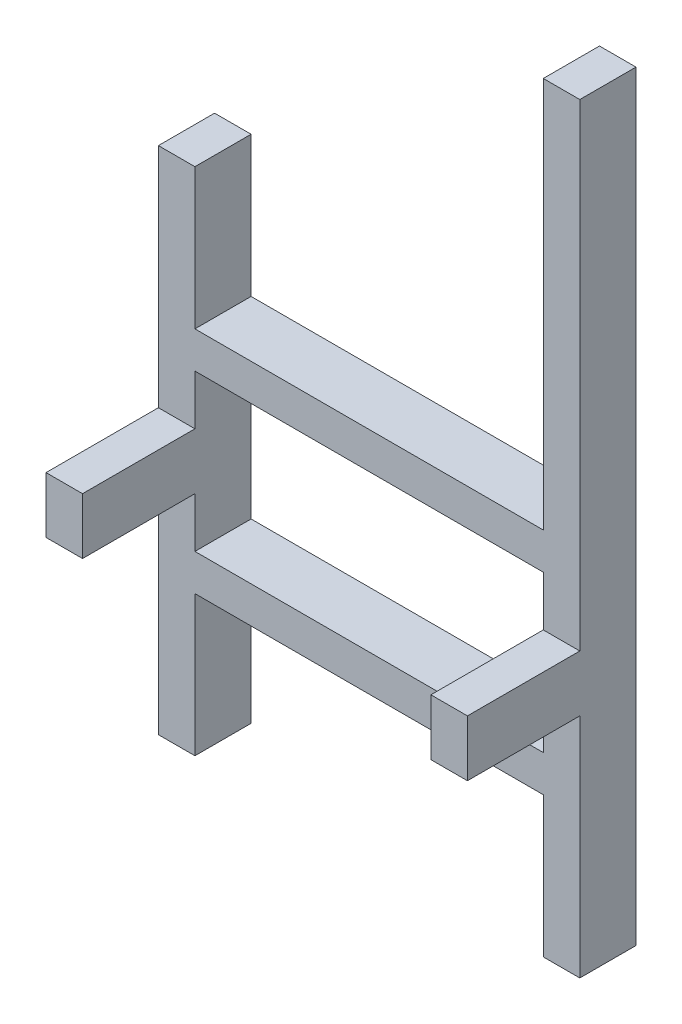
ISO-10303-21;
HEADER;
FILE_DESCRIPTION(('STEP AP214'),'2;1');
FILE_NAME('part.step','',(''),(''),'','','');
FILE_SCHEMA(('AUTOMOTIVE_DESIGN { 1 0 10303 214 1 1 1 1 }'));
ENDSEC;
DATA;
#1=APPLICATION_CONTEXT('core data for automotive mechanical design processes');
#2=APPLICATION_PROTOCOL_DEFINITION('international standard','automotive_design',2000,#1);
#3=PRODUCT_CONTEXT('',#1,'mechanical');
#4=PRODUCT('Part','Part','',(#3));
#5=PRODUCT_RELATED_PRODUCT_CATEGORY('part','',(#4));
#6=PRODUCT_DEFINITION_FORMATION('','',#4);
#7=PRODUCT_DEFINITION_CONTEXT('part definition',#1,'design');
#8=PRODUCT_DEFINITION('design','',#6,#7);
#9=PRODUCT_DEFINITION_SHAPE('','',#8);
#10=(LENGTH_UNIT() NAMED_UNIT(*) SI_UNIT(.MILLI.,.METRE.));
#11=(NAMED_UNIT(*) PLANE_ANGLE_UNIT() SI_UNIT($,.RADIAN.));
#12=(NAMED_UNIT(*) SI_UNIT($,.STERADIAN.) SOLID_ANGLE_UNIT());
#13=UNCERTAINTY_MEASURE_WITH_UNIT(LENGTH_MEASURE(1.E-05),#10,'distance_accuracy_value','');
#14=(GEOMETRIC_REPRESENTATION_CONTEXT(3) GLOBAL_UNCERTAINTY_ASSIGNED_CONTEXT((#13)) GLOBAL_UNIT_ASSIGNED_CONTEXT((#10,
#11,#12)) REPRESENTATION_CONTEXT('',''));
#15=CARTESIAN_POINT('',(0.,0.,0.));
#16=DIRECTION('',(0.,0.,1.));
#17=DIRECTION('',(1.,0.,0.));
#18=AXIS2_PLACEMENT_3D('',#15,#16,#17);
#19=CARTESIAN_POINT('',(0.,0.,10.));
#20=DIRECTION('',(0.,0.,-1.));
#21=DIRECTION('',(-1.,0.,0.));
#22=AXIS2_PLACEMENT_3D('',#19,#20,#21);
#23=PLANE('',#22);
#24=DIRECTION('',(1.,0.,0.));
#25=VECTOR('',#24,1.);
#26=CARTESIAN_POINT('',(0.,40.4,10.));
#27=LINE('',#26,#25);
#28=CARTESIAN_POINT('',(0.,40.4,10.));
#29=VERTEX_POINT('',#28);
#30=CARTESIAN_POINT('',(6.5,40.4,10.));
#31=VERTEX_POINT('',#30);
#32=EDGE_CURVE('E111',#29,#31,#27,.T.);
#33=ORIENTED_EDGE('',*,*,#32,.F.);
#34=DIRECTION('',(0.,-1.,0.));
#35=VECTOR('',#34,1.);
#36=CARTESIAN_POINT('',(0.,90.8,10.));
#37=LINE('',#36,#35);
#38=CARTESIAN_POINT('',(0.,0.,10.));
#39=VERTEX_POINT('',#38);
#40=EDGE_CURVE('E371',#29,#39,#37,.T.);
#41=ORIENTED_EDGE('',*,*,#40,.T.);
#42=DIRECTION('',(1.,0.,0.));
#43=VECTOR('',#42,1.);
#44=CARTESIAN_POINT('',(0.,0.,10.));
#45=LINE('',#44,#43);
#46=CARTESIAN_POINT('',(6.5,0.,10.));
#47=VERTEX_POINT('',#46);
#48=EDGE_CURVE('E356',#39,#47,#45,.T.);
#49=ORIENTED_EDGE('',*,*,#48,.T.);
#50=DIRECTION('',(0.,-1.,0.));
#51=VECTOR('',#50,1.);
#52=CARTESIAN_POINT('',(6.49999999999999,90.8,10.));
#53=LINE('',#52,#51);
#54=CARTESIAN_POINT('',(6.5,25.,10.));
#55=VERTEX_POINT('',#54);
#56=EDGE_CURVE('E360',#55,#47,#53,.T.);
#57=ORIENTED_EDGE('',*,*,#56,.F.);
#58=DIRECTION('',(1.,0.,0.));
#59=VECTOR('',#58,1.);
#60=CARTESIAN_POINT('',(6.50000000000001,25.,10.));
#61=LINE('',#60,#59);
#62=CARTESIAN_POINT('',(68.5,25.,10.));
#63=VERTEX_POINT('',#62);
#64=EDGE_CURVE('E411',#55,#63,#61,.T.);
#65=ORIENTED_EDGE('',*,*,#64,.T.);
#66=DIRECTION('',(0.,-1.,0.));
#67=VECTOR('',#66,1.);
#68=CARTESIAN_POINT('',(68.5,135.4,10.));
#69=LINE('',#68,#67);
#70=CARTESIAN_POINT('',(68.5,0.,10.));
#71=VERTEX_POINT('',#70);
#72=EDGE_CURVE('E446',#63,#71,#69,.T.);
#73=ORIENTED_EDGE('',*,*,#72,.T.);
#74=DIRECTION('',(1.,0.,0.));
#75=VECTOR('',#74,1.);
#76=CARTESIAN_POINT('',(68.5,0.,10.));
#77=LINE('',#76,#75);
#78=CARTESIAN_POINT('',(75.,0.,10.));
#79=VERTEX_POINT('',#78);
#80=EDGE_CURVE('E434',#71,#79,#77,.T.);
#81=ORIENTED_EDGE('',*,*,#80,.T.);
#82=DIRECTION('',(0.,-1.,0.));
#83=VECTOR('',#82,1.);
#84=CARTESIAN_POINT('',(75.,135.4,10.));
#85=LINE('',#84,#83);
#86=CARTESIAN_POINT('',(75.,40.4,10.));
#87=VERTEX_POINT('',#86);
#88=EDGE_CURVE('E118',#87,#79,#85,.T.);
#89=ORIENTED_EDGE('',*,*,#88,.F.);
#90=DIRECTION('',(1.,0.,0.));
#91=VECTOR('',#90,1.);
#92=CARTESIAN_POINT('',(68.5,40.4,10.));
#93=LINE('',#92,#91);
#94=CARTESIAN_POINT('',(68.5,40.4,10.));
#95=VERTEX_POINT('',#94);
#96=EDGE_CURVE('E311',#95,#87,#93,.T.);
#97=ORIENTED_EDGE('',*,*,#96,.F.);
#98=CARTESIAN_POINT('',(68.5,31.5,10.));
#99=VERTEX_POINT('',#98);
#100=EDGE_CURVE('E452',#95,#99,#69,.T.);
#101=ORIENTED_EDGE('',*,*,#100,.T.);
#102=DIRECTION('',(1.,0.,0.));
#103=VECTOR('',#102,1.);
#104=CARTESIAN_POINT('',(6.50000000000001,31.5,10.));
#105=LINE('',#104,#103);
#106=CARTESIAN_POINT('',(6.5,31.5,10.));
#107=VERTEX_POINT('',#106);
#108=EDGE_CURVE('E407',#107,#99,#105,.T.);
#109=ORIENTED_EDGE('',*,*,#108,.F.);
#110=EDGE_CURVE('E367',#31,#107,#53,.T.);
#111=ORIENTED_EDGE('',*,*,#110,.F.);
#112=EDGE_LOOP('',(#33,#41,#49,#57,#65,#73,#81,#89,#97,#101,#109,#111));
#113=FACE_BOUND('',#112,.T.);
#114=ADVANCED_FACE('F93',(#113),#23,.F.);
#115=DIRECTION('',(-1.,0.,0.));
#116=VECTOR('',#115,1.);
#117=CARTESIAN_POINT('',(0.,50.4,10.));
#118=LINE('',#117,#116);
#119=CARTESIAN_POINT('',(6.49999999999999,50.4,10.));
#120=VERTEX_POINT('',#119);
#121=CARTESIAN_POINT('',(0.,50.4,10.));
#122=VERTEX_POINT('',#121);
#123=EDGE_CURVE('E319',#120,#122,#118,.T.);
#124=ORIENTED_EDGE('',*,*,#123,.F.);
#125=CARTESIAN_POINT('',(6.5,59.3,10.));
#126=VERTEX_POINT('',#125);
#127=EDGE_CURVE('E281',#126,#120,#53,.T.);
#128=ORIENTED_EDGE('',*,*,#127,.F.);
#129=DIRECTION('',(1.,0.,0.));
#130=VECTOR('',#129,1.);
#131=CARTESIAN_POINT('',(6.5,59.3,10.));
#132=LINE('',#131,#130);
#133=CARTESIAN_POINT('',(68.5,59.3,10.));
#134=VERTEX_POINT('',#133);
#135=EDGE_CURVE('E331',#126,#134,#132,.T.);
#136=ORIENTED_EDGE('',*,*,#135,.T.);
#137=CARTESIAN_POINT('',(68.5,50.4,10.));
#138=VERTEX_POINT('',#137);
#139=EDGE_CURVE('E451',#134,#138,#69,.T.);
#140=ORIENTED_EDGE('',*,*,#139,.T.);
#141=DIRECTION('',(-1.,0.,0.));
#142=VECTOR('',#141,1.);
#143=CARTESIAN_POINT('',(68.5,50.4,10.));
#144=LINE('',#143,#142);
#145=CARTESIAN_POINT('',(75.,50.4,10.));
#146=VERTEX_POINT('',#145);
#147=EDGE_CURVE('E314',#146,#138,#144,.T.);
#148=ORIENTED_EDGE('',*,*,#147,.F.);
#149=CARTESIAN_POINT('',(75.,135.4,10.));
#150=VERTEX_POINT('',#149);
#151=EDGE_CURVE('E438',#150,#146,#85,.T.);
#152=ORIENTED_EDGE('',*,*,#151,.F.);
#153=DIRECTION('',(1.,0.,0.));
#154=VECTOR('',#153,1.);
#155=CARTESIAN_POINT('',(68.5,135.4,10.));
#156=LINE('',#155,#154);
#157=CARTESIAN_POINT('',(68.5,135.4,10.));
#158=VERTEX_POINT('',#157);
#159=EDGE_CURVE('E442',#158,#150,#156,.T.);
#160=ORIENTED_EDGE('',*,*,#159,.F.);
#161=CARTESIAN_POINT('',(68.5,65.8,10.));
#162=VERTEX_POINT('',#161);
#163=EDGE_CURVE('E447',#158,#162,#69,.T.);
#164=ORIENTED_EDGE('',*,*,#163,.T.);
#165=DIRECTION('',(1.,0.,0.));
#166=VECTOR('',#165,1.);
#167=CARTESIAN_POINT('',(6.5,65.8,10.));
#168=LINE('',#167,#166);
#169=CARTESIAN_POINT('',(6.5,65.8,10.));
#170=VERTEX_POINT('',#169);
#171=EDGE_CURVE('E335',#170,#162,#168,.T.);
#172=ORIENTED_EDGE('',*,*,#171,.F.);
#173=CARTESIAN_POINT('',(6.49999999999999,90.8,10.));
#174=VERTEX_POINT('',#173);
#175=EDGE_CURVE('E362',#174,#170,#53,.T.);
#176=ORIENTED_EDGE('',*,*,#175,.F.);
#177=DIRECTION('',(1.,0.,0.));
#178=VECTOR('',#177,1.);
#179=CARTESIAN_POINT('',(0.,90.8,10.));
#180=LINE('',#179,#178);
#181=CARTESIAN_POINT('',(0.,90.8,10.));
#182=VERTEX_POINT('',#181);
#183=EDGE_CURVE('E366',#182,#174,#180,.T.);
#184=ORIENTED_EDGE('',*,*,#183,.F.);
#185=EDGE_CURVE('E372',#182,#122,#37,.T.);
#186=ORIENTED_EDGE('',*,*,#185,.T.);
#187=EDGE_LOOP('',(#124,#128,#136,#140,#148,#152,#160,#164,#172,#176,#184,#186));
#188=FACE_BOUND('',#187,.T.);
#189=ADVANCED_FACE('F496',(#188),#23,.F.);
#190=CARTESIAN_POINT('',(6.5,65.8,10.));
#191=DIRECTION('',(0.,1.,0.));
#192=DIRECTION('',(0.,0.,1.));
#193=AXIS2_PLACEMENT_3D('',#190,#191,#192);
#194=PLANE('',#193);
#195=DIRECTION('',(1.,0.,0.));
#196=VECTOR('',#195,1.);
#197=CARTESIAN_POINT('',(6.5,65.8,0.));
#198=LINE('',#197,#196);
#199=CARTESIAN_POINT('',(6.5,65.8,0.));
#200=VERTEX_POINT('',#199);
#201=CARTESIAN_POINT('',(68.5,65.8,0.));
#202=VERTEX_POINT('',#201);
#203=EDGE_CURVE('E336',#200,#202,#198,.T.);
#204=ORIENTED_EDGE('',*,*,#203,.F.);
#205=DIRECTION('',(0.,0.,-1.));
#206=VECTOR('',#205,1.);
#207=CARTESIAN_POINT('',(6.5,65.8,10.));
#208=LINE('',#207,#206);
#209=EDGE_CURVE('E351',#170,#200,#208,.T.);
#210=ORIENTED_EDGE('',*,*,#209,.F.);
#211=ORIENTED_EDGE('',*,*,#171,.T.);
#212=DIRECTION('',(0.,0.,-1.));
#213=VECTOR('',#212,1.);
#214=CARTESIAN_POINT('',(68.5,65.8,10.));
#215=LINE('',#214,#213);
#216=EDGE_CURVE('E103',#162,#202,#215,.T.);
#217=ORIENTED_EDGE('',*,*,#216,.T.);
#218=EDGE_LOOP('',(#204,#210,#211,#217));
#219=FACE_BOUND('',#218,.T.);
#220=ADVANCED_FACE('F590',(#219),#194,.T.);
#221=CARTESIAN_POINT('',(6.5,59.3,10.));
#222=DIRECTION('',(0.,1.,0.));
#223=DIRECTION('',(0.,0.,1.));
#224=AXIS2_PLACEMENT_3D('',#221,#222,#223);
#225=PLANE('',#224);
#226=DIRECTION('',(1.,0.,0.));
#227=VECTOR('',#226,1.);
#228=CARTESIAN_POINT('',(6.5,59.3,0.));
#229=LINE('',#228,#227);
#230=CARTESIAN_POINT('',(6.5,59.3,0.));
#231=VERTEX_POINT('',#230);
#232=CARTESIAN_POINT('',(68.5,59.3,0.));
#233=VERTEX_POINT('',#232);
#234=EDGE_CURVE('E341',#231,#233,#229,.T.);
#235=ORIENTED_EDGE('',*,*,#234,.T.);
#236=DIRECTION('',(0.,0.,-1.));
#237=VECTOR('',#236,1.);
#238=CARTESIAN_POINT('',(68.5,59.3,10.));
#239=LINE('',#238,#237);
#240=EDGE_CURVE('E12',#134,#233,#239,.T.);
#241=ORIENTED_EDGE('',*,*,#240,.F.);
#242=ORIENTED_EDGE('',*,*,#135,.F.);
#243=DIRECTION('',(0.,0.,-1.));
#244=VECTOR('',#243,1.);
#245=CARTESIAN_POINT('',(6.5,59.3,10.));
#246=LINE('',#245,#244);
#247=EDGE_CURVE('E340',#126,#231,#246,.T.);
#248=ORIENTED_EDGE('',*,*,#247,.T.);
#249=EDGE_LOOP('',(#235,#241,#242,#248));
#250=FACE_BOUND('',#249,.T.);
#251=ADVANCED_FACE('F596',(#250),#225,.F.);
#252=CARTESIAN_POINT('',(0.,0.,0.));
#253=DIRECTION('',(0.,0.,-1.));
#254=DIRECTION('',(-1.,0.,0.));
#255=AXIS2_PLACEMENT_3D('',#252,#253,#254);
#256=PLANE('',#255);
#257=DIRECTION('',(1.,0.,0.));
#258=VECTOR('',#257,1.);
#259=CARTESIAN_POINT('',(6.50000000000001,31.5,0.));
#260=LINE('',#259,#258);
#261=CARTESIAN_POINT('',(6.5,31.5,0.));
#262=VERTEX_POINT('',#261);
#263=CARTESIAN_POINT('',(68.5,31.5,0.));
#264=VERTEX_POINT('',#263);
#265=EDGE_CURVE('E417',#262,#264,#260,.T.);
#266=ORIENTED_EDGE('',*,*,#265,.T.);
#267=DIRECTION('',(0.,-1.,0.));
#268=VECTOR('',#267,1.);
#269=CARTESIAN_POINT('',(68.5,135.4,0.));
#270=LINE('',#269,#268);
#271=EDGE_CURVE('E465',#233,#264,#270,.T.);
#272=ORIENTED_EDGE('',*,*,#271,.F.);
#273=ORIENTED_EDGE('',*,*,#234,.F.);
#274=DIRECTION('',(0.,-1.,0.));
#275=VECTOR('',#274,1.);
#276=CARTESIAN_POINT('',(6.49999999999999,90.8,0.));
#277=LINE('',#276,#275);
#278=EDGE_CURVE('E387',#231,#262,#277,.T.);
#279=ORIENTED_EDGE('',*,*,#278,.T.);
#280=EDGE_LOOP('',(#266,#272,#273,#279));
#281=FACE_BOUND('',#280,.T.);
#282=CARTESIAN_POINT('',(68.5,25.,0.));
#283=VERTEX_POINT('',#282);
#284=CARTESIAN_POINT('',(68.5,0.,0.));
#285=VERTEX_POINT('',#284);
#286=EDGE_CURVE('E461',#283,#285,#270,.T.);
#287=ORIENTED_EDGE('',*,*,#286,.F.);
#288=DIRECTION('',(1.,0.,0.));
#289=VECTOR('',#288,1.);
#290=CARTESIAN_POINT('',(6.50000000000001,25.,0.));
#291=LINE('',#290,#289);
#292=CARTESIAN_POINT('',(6.5,25.,0.));
#293=VERTEX_POINT('',#292);
#294=EDGE_CURVE('E412',#293,#283,#291,.T.);
#295=ORIENTED_EDGE('',*,*,#294,.F.);
#296=CARTESIAN_POINT('',(6.5,0.,0.));
#297=VERTEX_POINT('',#296);
#298=EDGE_CURVE('E380',#293,#297,#277,.T.);
#299=ORIENTED_EDGE('',*,*,#298,.T.);
#300=DIRECTION('',(1.,0.,0.));
#301=VECTOR('',#300,1.);
#302=CARTESIAN_POINT('',(0.,0.,0.));
#303=LINE('',#302,#301);
#304=CARTESIAN_POINT('',(0.,0.,0.));
#305=VERTEX_POINT('',#304);
#306=EDGE_CURVE('E376',#305,#297,#303,.T.);
#307=ORIENTED_EDGE('',*,*,#306,.F.);
#308=DIRECTION('',(0.,-1.,0.));
#309=VECTOR('',#308,1.);
#310=CARTESIAN_POINT('',(0.,90.8,0.));
#311=LINE('',#310,#309);
#312=CARTESIAN_POINT('',(0.,90.8,0.));
#313=VERTEX_POINT('',#312);
#314=EDGE_CURVE('E361',#313,#305,#311,.T.);
#315=ORIENTED_EDGE('',*,*,#314,.F.);
#316=DIRECTION('',(1.,0.,0.));
#317=VECTOR('',#316,1.);
#318=CARTESIAN_POINT('',(0.,90.8,0.));
#319=LINE('',#318,#317);
#320=CARTESIAN_POINT('',(6.49999999999999,90.8,0.));
#321=VERTEX_POINT('',#320);
#322=EDGE_CURVE('E386',#313,#321,#319,.T.);
#323=ORIENTED_EDGE('',*,*,#322,.T.);
#324=EDGE_CURVE('E382',#321,#200,#277,.T.);
#325=ORIENTED_EDGE('',*,*,#324,.T.);
#326=ORIENTED_EDGE('',*,*,#203,.T.);
#327=CARTESIAN_POINT('',(68.5,135.4,0.));
#328=VERTEX_POINT('',#327);
#329=EDGE_CURVE('E437',#328,#202,#270,.T.);
#330=ORIENTED_EDGE('',*,*,#329,.F.);
#331=DIRECTION('',(1.,0.,0.));
#332=VECTOR('',#331,1.);
#333=CARTESIAN_POINT('',(68.5,135.4,0.));
#334=LINE('',#333,#332);
#335=CARTESIAN_POINT('',(75.,135.4,0.));
#336=VERTEX_POINT('',#335);
#337=EDGE_CURVE('E457',#328,#336,#334,.T.);
#338=ORIENTED_EDGE('',*,*,#337,.T.);
#339=DIRECTION('',(0.,-1.,0.));
#340=VECTOR('',#339,1.);
#341=CARTESIAN_POINT('',(75.,135.4,0.));
#342=LINE('',#341,#340);
#343=CARTESIAN_POINT('',(75.,0.,0.));
#344=VERTEX_POINT('',#343);
#345=EDGE_CURVE('E288',#336,#344,#342,.T.);
#346=ORIENTED_EDGE('',*,*,#345,.T.);
#347=DIRECTION('',(1.,0.,0.));
#348=VECTOR('',#347,1.);
#349=CARTESIAN_POINT('',(68.5,0.,0.));
#350=LINE('',#349,#348);
#351=EDGE_CURVE('E283',#285,#344,#350,.T.);
#352=ORIENTED_EDGE('',*,*,#351,.F.);
#353=EDGE_LOOP('',(#287,#295,#299,#307,#315,#323,#325,#326,#330,#338,#346,#352));
#354=FACE_BOUND('',#353,.T.);
#355=ADVANCED_FACE('F486',(#281,#354),#256,.T.);
#356=CARTESIAN_POINT('',(6.50000000000001,25.,10.));
#357=DIRECTION('',(0.,1.,0.));
#358=DIRECTION('',(0.,0.,1.));
#359=AXIS2_PLACEMENT_3D('',#356,#357,#358);
#360=PLANE('',#359);
#361=ORIENTED_EDGE('',*,*,#294,.T.);
#362=DIRECTION('',(0.,0.,-1.));
#363=VECTOR('',#362,1.);
#364=CARTESIAN_POINT('',(68.5,25.,10.));
#365=LINE('',#364,#363);
#366=EDGE_CURVE('E381',#63,#283,#365,.T.);
#367=ORIENTED_EDGE('',*,*,#366,.F.);
#368=ORIENTED_EDGE('',*,*,#64,.F.);
#369=DIRECTION('',(0.,0.,-1.));
#370=VECTOR('',#369,1.);
#371=CARTESIAN_POINT('',(6.50000000000001,25.,10.));
#372=LINE('',#371,#370);
#373=EDGE_CURVE('E345',#55,#293,#372,.T.);
#374=ORIENTED_EDGE('',*,*,#373,.T.);
#375=EDGE_LOOP('',(#361,#367,#368,#374));
#376=FACE_BOUND('',#375,.T.);
#377=ADVANCED_FACE('F578',(#376),#360,.F.);
#378=CARTESIAN_POINT('',(6.50000000000001,31.5,10.));
#379=DIRECTION('',(0.,1.,0.));
#380=DIRECTION('',(0.,0.,1.));
#381=AXIS2_PLACEMENT_3D('',#378,#379,#380);
#382=PLANE('',#381);
#383=ORIENTED_EDGE('',*,*,#265,.F.);
#384=DIRECTION('',(0.,0.,-1.));
#385=VECTOR('',#384,1.);
#386=CARTESIAN_POINT('',(6.50000000000001,31.5,10.));
#387=LINE('',#386,#385);
#388=EDGE_CURVE('E406',#107,#262,#387,.T.);
#389=ORIENTED_EDGE('',*,*,#388,.F.);
#390=ORIENTED_EDGE('',*,*,#108,.T.);
#391=DIRECTION('',(0.,0.,-1.));
#392=VECTOR('',#391,1.);
#393=CARTESIAN_POINT('',(68.5,31.5,10.));
#394=LINE('',#393,#392);
#395=EDGE_CURVE('E416',#99,#264,#394,.T.);
#396=ORIENTED_EDGE('',*,*,#395,.T.);
#397=EDGE_LOOP('',(#383,#389,#390,#396));
#398=FACE_BOUND('',#397,.T.);
#399=ADVANCED_FACE('F532',(#398),#382,.T.);
#400=CARTESIAN_POINT('',(6.49999999999999,90.8,10.));
#401=DIRECTION('',(1.,0.,0.));
#402=DIRECTION('',(0.,1.,0.));
#403=AXIS2_PLACEMENT_3D('',#400,#401,#402);
#404=PLANE('',#403);
#405=ORIENTED_EDGE('',*,*,#373,.F.);
#406=ORIENTED_EDGE('',*,*,#56,.T.);
#407=DIRECTION('',(0.,0.,-1.));
#408=VECTOR('',#407,1.);
#409=CARTESIAN_POINT('',(6.5,0.,10.));
#410=LINE('',#409,#408);
#411=EDGE_CURVE('E402',#47,#297,#410,.T.);
#412=ORIENTED_EDGE('',*,*,#411,.T.);
#413=ORIENTED_EDGE('',*,*,#298,.F.);
#414=EDGE_LOOP('',(#405,#406,#412,#413));
#415=FACE_BOUND('',#414,.T.);
#416=ADVANCED_FACE('F566',(#415),#404,.T.);
#417=CARTESIAN_POINT('',(75.,135.4,10.));
#418=DIRECTION('',(1.,0.,0.));
#419=DIRECTION('',(0.,1.,0.));
#420=AXIS2_PLACEMENT_3D('',#417,#418,#419);
#421=PLANE('',#420);
#422=ORIENTED_EDGE('',*,*,#345,.F.);
#423=DIRECTION('',(0.,0.,-1.));
#424=VECTOR('',#423,1.);
#425=CARTESIAN_POINT('',(75.,135.4,10.));
#426=LINE('',#425,#424);
#427=EDGE_CURVE('E471',#150,#336,#426,.T.);
#428=ORIENTED_EDGE('',*,*,#427,.F.);
#429=ORIENTED_EDGE('',*,*,#151,.T.);
#430=DIRECTION('',(0.,0.,-1.));
#431=VECTOR('',#430,1.);
#432=CARTESIAN_POINT('',(75.,50.4,30.));
#433=LINE('',#432,#431);
#434=CARTESIAN_POINT('',(75.,50.4,30.));
#435=VERTEX_POINT('',#434);
#436=EDGE_CURVE('E294',#435,#146,#433,.T.);
#437=ORIENTED_EDGE('',*,*,#436,.F.);
#438=DIRECTION('',(0.,1.,0.));
#439=VECTOR('',#438,1.);
#440=CARTESIAN_POINT('',(75.,40.4,30.));
#441=LINE('',#440,#439);
#442=CARTESIAN_POINT('',(75.,40.4,30.));
#443=VERTEX_POINT('',#442);
#444=EDGE_CURVE('E315',#443,#435,#441,.T.);
#445=ORIENTED_EDGE('',*,*,#444,.F.);
#446=DIRECTION('',(0.,0.,-1.));
#447=VECTOR('',#446,1.);
#448=CARTESIAN_POINT('',(75.,40.4,30.));
#449=LINE('',#448,#447);
#450=EDGE_CURVE('E306',#443,#87,#449,.T.);
#451=ORIENTED_EDGE('',*,*,#450,.T.);
#452=ORIENTED_EDGE('',*,*,#88,.T.);
#453=DIRECTION('',(0.,0.,-1.));
#454=VECTOR('',#453,1.);
#455=CARTESIAN_POINT('',(75.,0.,10.));
#456=LINE('',#455,#454);
#457=EDGE_CURVE('E97',#79,#344,#456,.T.);
#458=ORIENTED_EDGE('',*,*,#457,.T.);
#459=EDGE_LOOP('',(#422,#428,#429,#437,#445,#451,#452,#458));
#460=FACE_BOUND('',#459,.T.);
#461=ADVANCED_FACE('F479',(#460),#421,.T.);
#462=CARTESIAN_POINT('',(68.5,135.4,10.));
#463=DIRECTION('',(0.,1.,0.));
#464=DIRECTION('',(-1.,0.,0.));
#465=AXIS2_PLACEMENT_3D('',#462,#463,#464);
#466=PLANE('',#465);
#467=ORIENTED_EDGE('',*,*,#337,.F.);
#468=DIRECTION('',(0.,0.,-1.));
#469=VECTOR('',#468,1.);
#470=CARTESIAN_POINT('',(68.5,135.4,10.));
#471=LINE('',#470,#469);
#472=EDGE_CURVE('E469',#158,#328,#471,.T.);
#473=ORIENTED_EDGE('',*,*,#472,.F.);
#474=ORIENTED_EDGE('',*,*,#159,.T.);
#475=ORIENTED_EDGE('',*,*,#427,.T.);
#476=EDGE_LOOP('',(#467,#473,#474,#475));
#477=FACE_BOUND('',#476,.T.);
#478=ADVANCED_FACE('F488',(#477),#466,.T.);
#479=CARTESIAN_POINT('',(68.5,135.4,10.));
#480=DIRECTION('',(1.,0.,0.));
#481=DIRECTION('',(0.,1.,0.));
#482=AXIS2_PLACEMENT_3D('',#479,#480,#481);
#483=PLANE('',#482);
#484=ORIENTED_EDGE('',*,*,#216,.F.);
#485=ORIENTED_EDGE('',*,*,#163,.F.);
#486=ORIENTED_EDGE('',*,*,#472,.T.);
#487=ORIENTED_EDGE('',*,*,#329,.T.);
#488=EDGE_LOOP('',(#484,#485,#486,#487));
#489=FACE_BOUND('',#488,.T.);
#490=ADVANCED_FACE('F492',(#489),#483,.F.);
#491=ORIENTED_EDGE('',*,*,#139,.F.);
#492=ORIENTED_EDGE('',*,*,#240,.T.);
#493=ORIENTED_EDGE('',*,*,#271,.T.);
#494=ORIENTED_EDGE('',*,*,#395,.F.);
#495=ORIENTED_EDGE('',*,*,#100,.F.);
#496=DIRECTION('',(0.,0.,-1.));
#497=VECTOR('',#496,1.);
#498=CARTESIAN_POINT('',(68.5,40.4,30.));
#499=LINE('',#498,#497);
#500=CARTESIAN_POINT('',(68.5,40.4,30.));
#501=VERTEX_POINT('',#500);
#502=EDGE_CURVE('E302',#501,#95,#499,.T.);
#503=ORIENTED_EDGE('',*,*,#502,.F.);
#504=DIRECTION('',(0.,-1.,0.));
#505=VECTOR('',#504,1.);
#506=CARTESIAN_POINT('',(68.5,40.4,30.));
#507=LINE('',#506,#505);
#508=CARTESIAN_POINT('',(68.5,50.4,30.));
#509=VERTEX_POINT('',#508);
#510=EDGE_CURVE('E322',#509,#501,#507,.T.);
#511=ORIENTED_EDGE('',*,*,#510,.F.);
#512=DIRECTION('',(0.,0.,-1.));
#513=VECTOR('',#512,1.);
#514=CARTESIAN_POINT('',(68.5,50.4,30.));
#515=LINE('',#514,#513);
#516=EDGE_CURVE('E298',#509,#138,#515,.T.);
#517=ORIENTED_EDGE('',*,*,#516,.T.);
#518=EDGE_LOOP('',(#491,#492,#493,#494,#495,#503,#511,#517));
#519=FACE_BOUND('',#518,.T.);
#520=ADVANCED_FACE('F515',(#519),#483,.F.);
#521=ORIENTED_EDGE('',*,*,#72,.F.);
#522=ORIENTED_EDGE('',*,*,#366,.T.);
#523=ORIENTED_EDGE('',*,*,#286,.T.);
#524=DIRECTION('',(0.,0.,-1.));
#525=VECTOR('',#524,1.);
#526=CARTESIAN_POINT('',(68.5,0.,10.));
#527=LINE('',#526,#525);
#528=EDGE_CURVE('E450',#71,#285,#527,.T.);
#529=ORIENTED_EDGE('',*,*,#528,.F.);
#530=EDGE_LOOP('',(#521,#522,#523,#529));
#531=FACE_BOUND('',#530,.T.);
#532=ADVANCED_FACE('F523',(#531),#483,.F.);
#533=CARTESIAN_POINT('',(68.5,0.,10.));
#534=DIRECTION('',(0.,1.,0.));
#535=DIRECTION('',(0.,0.,1.));
#536=AXIS2_PLACEMENT_3D('',#533,#534,#535);
#537=PLANE('',#536);
#538=ORIENTED_EDGE('',*,*,#351,.T.);
#539=ORIENTED_EDGE('',*,*,#457,.F.);
#540=ORIENTED_EDGE('',*,*,#80,.F.);
#541=ORIENTED_EDGE('',*,*,#528,.T.);
#542=EDGE_LOOP('',(#538,#539,#540,#541));
#543=FACE_BOUND('',#542,.T.);
#544=ADVANCED_FACE('F95',(#543),#537,.F.);
#545=ORIENTED_EDGE('',*,*,#247,.F.);
#546=ORIENTED_EDGE('',*,*,#127,.T.);
#547=DIRECTION('',(0.,0.,-1.));
#548=VECTOR('',#547,1.);
#549=CARTESIAN_POINT('',(6.5,50.4,30.));
#550=LINE('',#549,#548);
#551=CARTESIAN_POINT('',(6.5,50.4,30.));
#552=VERTEX_POINT('',#551);
#553=EDGE_CURVE('E260',#552,#120,#550,.T.);
#554=ORIENTED_EDGE('',*,*,#553,.F.);
#555=DIRECTION('',(0.,1.,0.));
#556=VECTOR('',#555,1.);
#557=CARTESIAN_POINT('',(6.5,40.4,30.));
#558=LINE('',#557,#556);
#559=CARTESIAN_POINT('',(6.5,40.4,30.));
#560=VERTEX_POINT('',#559);
#561=EDGE_CURVE('E267',#560,#552,#558,.T.);
#562=ORIENTED_EDGE('',*,*,#561,.F.);
#563=DIRECTION('',(0.,0.,-1.));
#564=VECTOR('',#563,1.);
#565=CARTESIAN_POINT('',(6.5,40.4,30.));
#566=LINE('',#565,#564);
#567=EDGE_CURVE('E540',#560,#31,#566,.T.);
#568=ORIENTED_EDGE('',*,*,#567,.T.);
#569=ORIENTED_EDGE('',*,*,#110,.T.);
#570=ORIENTED_EDGE('',*,*,#388,.T.);
#571=ORIENTED_EDGE('',*,*,#278,.F.);
#572=EDGE_LOOP('',(#545,#546,#554,#562,#568,#569,#570,#571));
#573=FACE_BOUND('',#572,.T.);
#574=ADVANCED_FACE('F279',(#573),#404,.T.);
#575=ORIENTED_EDGE('',*,*,#175,.T.);
#576=ORIENTED_EDGE('',*,*,#209,.T.);
#577=ORIENTED_EDGE('',*,*,#324,.F.);
#578=DIRECTION('',(0.,0.,-1.));
#579=VECTOR('',#578,1.);
#580=CARTESIAN_POINT('',(6.49999999999999,90.8,10.));
#581=LINE('',#580,#579);
#582=EDGE_CURVE('E399',#174,#321,#581,.T.);
#583=ORIENTED_EDGE('',*,*,#582,.F.);
#584=EDGE_LOOP('',(#575,#576,#577,#583));
#585=FACE_BOUND('',#584,.T.);
#586=ADVANCED_FACE('F583',(#585),#404,.T.);
#587=CARTESIAN_POINT('',(0.,90.8,10.));
#588=DIRECTION('',(0.,1.,0.));
#589=DIRECTION('',(0.,0.,1.));
#590=AXIS2_PLACEMENT_3D('',#587,#588,#589);
#591=PLANE('',#590);
#592=ORIENTED_EDGE('',*,*,#322,.F.);
#593=DIRECTION('',(0.,0.,-1.));
#594=VECTOR('',#593,1.);
#595=CARTESIAN_POINT('',(0.,90.8,10.));
#596=LINE('',#595,#594);
#597=EDGE_CURVE('E396',#182,#313,#596,.T.);
#598=ORIENTED_EDGE('',*,*,#597,.F.);
#599=ORIENTED_EDGE('',*,*,#183,.T.);
#600=ORIENTED_EDGE('',*,*,#582,.T.);
#601=EDGE_LOOP('',(#592,#598,#599,#600));
#602=FACE_BOUND('',#601,.T.);
#603=ADVANCED_FACE('F571',(#602),#591,.T.);
#604=CARTESIAN_POINT('',(0.,90.8,10.));
#605=DIRECTION('',(1.,0.,0.));
#606=DIRECTION('',(0.,1.,0.));
#607=AXIS2_PLACEMENT_3D('',#604,#605,#606);
#608=PLANE('',#607);
#609=ORIENTED_EDGE('',*,*,#314,.T.);
#610=DIRECTION('',(0.,0.,-1.));
#611=VECTOR('',#610,1.);
#612=CARTESIAN_POINT('',(0.,0.,10.));
#613=LINE('',#612,#611);
#614=EDGE_CURVE('E375',#39,#305,#613,.T.);
#615=ORIENTED_EDGE('',*,*,#614,.F.);
#616=ORIENTED_EDGE('',*,*,#40,.F.);
#617=DIRECTION('',(0.,0.,-1.));
#618=VECTOR('',#617,1.);
#619=CARTESIAN_POINT('',(0.,40.4,30.));
#620=LINE('',#619,#618);
#621=CARTESIAN_POINT('',(0.,40.4,30.));
#622=VERTEX_POINT('',#621);
#623=EDGE_CURVE('E290',#622,#29,#620,.T.);
#624=ORIENTED_EDGE('',*,*,#623,.F.);
#625=DIRECTION('',(0.,-1.,0.));
#626=VECTOR('',#625,1.);
#627=CARTESIAN_POINT('',(0.,40.4,30.));
#628=LINE('',#627,#626);
#629=CARTESIAN_POINT('',(0.,50.4,30.));
#630=VERTEX_POINT('',#629);
#631=EDGE_CURVE('E266',#630,#622,#628,.T.);
#632=ORIENTED_EDGE('',*,*,#631,.F.);
#633=DIRECTION('',(0.,0.,-1.));
#634=VECTOR('',#633,1.);
#635=CARTESIAN_POINT('',(0.,50.4,30.));
#636=LINE('',#635,#634);
#637=EDGE_CURVE('E262',#630,#122,#636,.T.);
#638=ORIENTED_EDGE('',*,*,#637,.T.);
#639=ORIENTED_EDGE('',*,*,#185,.F.);
#640=ORIENTED_EDGE('',*,*,#597,.T.);
#641=EDGE_LOOP('',(#609,#615,#616,#624,#632,#638,#639,#640));
#642=FACE_BOUND('',#641,.T.);
#643=ADVANCED_FACE('F554',(#642),#608,.F.);
#644=CARTESIAN_POINT('',(0.,0.,10.));
#645=DIRECTION('',(0.,1.,0.));
#646=DIRECTION('',(0.,0.,1.));
#647=AXIS2_PLACEMENT_3D('',#644,#645,#646);
#648=PLANE('',#647);
#649=ORIENTED_EDGE('',*,*,#306,.T.);
#650=ORIENTED_EDGE('',*,*,#411,.F.);
#651=ORIENTED_EDGE('',*,*,#48,.F.);
#652=ORIENTED_EDGE('',*,*,#614,.T.);
#653=EDGE_LOOP('',(#649,#650,#651,#652));
#654=FACE_BOUND('',#653,.T.);
#655=ADVANCED_FACE('F568',(#654),#648,.F.);
#656=CARTESIAN_POINT('',(68.5,50.4,30.));
#657=DIRECTION('',(0.,-1.,0.));
#658=DIRECTION('',(0.,0.,-1.));
#659=AXIS2_PLACEMENT_3D('',#656,#657,#658);
#660=PLANE('',#659);
#661=ORIENTED_EDGE('',*,*,#147,.T.);
#662=ORIENTED_EDGE('',*,*,#516,.F.);
#663=DIRECTION('',(-1.,0.,0.));
#664=VECTOR('',#663,1.);
#665=CARTESIAN_POINT('',(68.5,50.4,30.));
#666=LINE('',#665,#664);
#667=EDGE_CURVE('E325',#435,#509,#666,.T.);
#668=ORIENTED_EDGE('',*,*,#667,.F.);
#669=ORIENTED_EDGE('',*,*,#436,.T.);
#670=EDGE_LOOP('',(#661,#662,#668,#669));
#671=FACE_BOUND('',#670,.T.);
#672=ADVANCED_FACE('F500',(#671),#660,.F.);
#673=CARTESIAN_POINT('',(68.5,40.4,30.));
#674=DIRECTION('',(0.,1.,0.));
#675=DIRECTION('',(0.,0.,1.));
#676=AXIS2_PLACEMENT_3D('',#673,#674,#675);
#677=PLANE('',#676);
#678=ORIENTED_EDGE('',*,*,#96,.T.);
#679=ORIENTED_EDGE('',*,*,#450,.F.);
#680=DIRECTION('',(1.,0.,0.));
#681=VECTOR('',#680,1.);
#682=CARTESIAN_POINT('',(68.5,40.4,30.));
#683=LINE('',#682,#681);
#684=EDGE_CURVE('E310',#501,#443,#683,.T.);
#685=ORIENTED_EDGE('',*,*,#684,.F.);
#686=ORIENTED_EDGE('',*,*,#502,.T.);
#687=EDGE_LOOP('',(#678,#679,#685,#686));
#688=FACE_BOUND('',#687,.T.);
#689=ADVANCED_FACE('F508',(#688),#677,.F.);
#690=CARTESIAN_POINT('',(0.,0.,30.));
#691=DIRECTION('',(0.,0.,-1.));
#692=DIRECTION('',(-1.,0.,0.));
#693=AXIS2_PLACEMENT_3D('',#690,#691,#692);
#694=PLANE('',#693);
#695=ORIENTED_EDGE('',*,*,#444,.T.);
#696=ORIENTED_EDGE('',*,*,#667,.T.);
#697=ORIENTED_EDGE('',*,*,#510,.T.);
#698=ORIENTED_EDGE('',*,*,#684,.T.);
#699=EDGE_LOOP('',(#695,#696,#697,#698));
#700=FACE_BOUND('',#699,.T.);
#701=ADVANCED_FACE('F504',(#700),#694,.F.);
#702=CARTESIAN_POINT('',(0.,50.4,30.));
#703=DIRECTION('',(0.,-1.,0.));
#704=DIRECTION('',(0.,0.,-1.));
#705=AXIS2_PLACEMENT_3D('',#702,#703,#704);
#706=PLANE('',#705);
#707=ORIENTED_EDGE('',*,*,#123,.T.);
#708=ORIENTED_EDGE('',*,*,#637,.F.);
#709=DIRECTION('',(-1.,0.,0.));
#710=VECTOR('',#709,1.);
#711=CARTESIAN_POINT('',(0.,50.4,30.));
#712=LINE('',#711,#710);
#713=EDGE_CURVE('E255',#552,#630,#712,.T.);
#714=ORIENTED_EDGE('',*,*,#713,.F.);
#715=ORIENTED_EDGE('',*,*,#553,.T.);
#716=EDGE_LOOP('',(#707,#708,#714,#715));
#717=FACE_BOUND('',#716,.T.);
#718=ADVANCED_FACE('F258',(#717),#706,.F.);
#719=CARTESIAN_POINT('',(0.,40.4,30.));
#720=DIRECTION('',(0.,1.,0.));
#721=DIRECTION('',(-1.,0.,0.));
#722=AXIS2_PLACEMENT_3D('',#719,#720,#721);
#723=PLANE('',#722);
#724=ORIENTED_EDGE('',*,*,#32,.T.);
#725=ORIENTED_EDGE('',*,*,#567,.F.);
#726=DIRECTION('',(1.,0.,0.));
#727=VECTOR('',#726,1.);
#728=CARTESIAN_POINT('',(0.,40.4,30.));
#729=LINE('',#728,#727);
#730=EDGE_CURVE('E272',#622,#560,#729,.T.);
#731=ORIENTED_EDGE('',*,*,#730,.F.);
#732=ORIENTED_EDGE('',*,*,#623,.T.);
#733=EDGE_LOOP('',(#724,#725,#731,#732));
#734=FACE_BOUND('',#733,.T.);
#735=ADVANCED_FACE('F539',(#734),#723,.F.);
#736=CARTESIAN_POINT('',(0.,0.,30.));
#737=DIRECTION('',(0.,0.,-1.));
#738=DIRECTION('',(-1.,0.,0.));
#739=AXIS2_PLACEMENT_3D('',#736,#737,#738);
#740=PLANE('',#739);
#741=ORIENTED_EDGE('',*,*,#561,.T.);
#742=ORIENTED_EDGE('',*,*,#713,.T.);
#743=ORIENTED_EDGE('',*,*,#631,.T.);
#744=ORIENTED_EDGE('',*,*,#730,.T.);
#745=EDGE_LOOP('',(#741,#742,#743,#744));
#746=FACE_BOUND('',#745,.T.);
#747=ADVANCED_FACE('F270',(#746),#740,.F.);
#748=CLOSED_SHELL('',(#114,#189,#220,#251,#355,#377,#399,#416,#461,#478,#490,#520,#532,#544,
#574,#586,#603,#643,#655,#672,#689,#701,#718,#735,#747));
#749=MANIFOLD_SOLID_BREP('B2',#748);
#750=ADVANCED_BREP_SHAPE_REPRESENTATION('',(#18,#749),#14);
#751=SHAPE_DEFINITION_REPRESENTATION(#9,#750);
ENDSEC;
END-ISO-10303-21;
